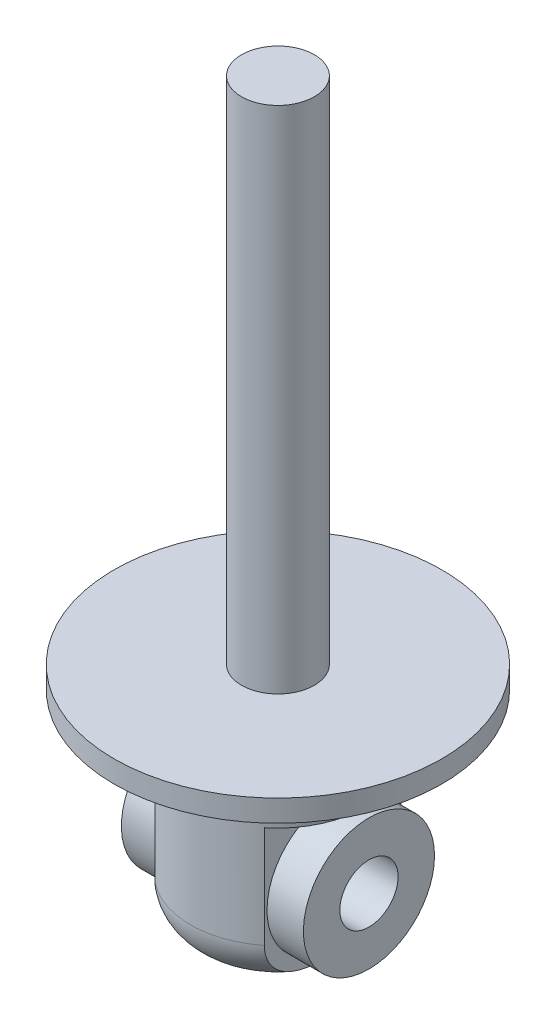
ISO-10303-21;
HEADER;
FILE_DESCRIPTION(('STEP AP214'),'2;1');
FILE_NAME('part.step','',(''),(''),'','','');
FILE_SCHEMA(('AUTOMOTIVE_DESIGN { 1 0 10303 214 1 1 1 1 }'));
ENDSEC;
DATA;
#1=APPLICATION_CONTEXT('core data for automotive mechanical design processes');
#2=APPLICATION_PROTOCOL_DEFINITION('international standard','automotive_design',2000,#1);
#3=PRODUCT_CONTEXT('',#1,'mechanical');
#4=PRODUCT('Part','Part','',(#3));
#5=PRODUCT_RELATED_PRODUCT_CATEGORY('part','',(#4));
#6=PRODUCT_DEFINITION_FORMATION('','',#4);
#7=PRODUCT_DEFINITION_CONTEXT('part definition',#1,'design');
#8=PRODUCT_DEFINITION('design','',#6,#7);
#9=PRODUCT_DEFINITION_SHAPE('','',#8);
#10=(LENGTH_UNIT() NAMED_UNIT(*) SI_UNIT(.MILLI.,.METRE.));
#11=(NAMED_UNIT(*) PLANE_ANGLE_UNIT() SI_UNIT($,.RADIAN.));
#12=(NAMED_UNIT(*) SI_UNIT($,.STERADIAN.) SOLID_ANGLE_UNIT());
#13=UNCERTAINTY_MEASURE_WITH_UNIT(LENGTH_MEASURE(1.E-05),#10,'distance_accuracy_value','');
#14=(GEOMETRIC_REPRESENTATION_CONTEXT(3) GLOBAL_UNCERTAINTY_ASSIGNED_CONTEXT((#13)) GLOBAL_UNIT_ASSIGNED_CONTEXT((#10,
#11,#12)) REPRESENTATION_CONTEXT('',''));
#15=CARTESIAN_POINT('',(0.,0.,0.));
#16=DIRECTION('',(0.,0.,1.));
#17=DIRECTION('',(1.,0.,0.));
#18=AXIS2_PLACEMENT_3D('',#15,#16,#17);
#19=CARTESIAN_POINT('',(-7.5,-8.,-22.5));
#20=DIRECTION('',(1.,0.,0.));
#21=DIRECTION('',(0.,1.,0.));
#22=AXIS2_PLACEMENT_3D('',#19,#20,#21);
#23=PLANE('',#22);
#24=CARTESIAN_POINT('',(-7.5,-27.8094750193111,0.));
#25=CARTESIAN_POINT('',(-7.5,-27.8094752958151,0.184521628242419));
#26=CARTESIAN_POINT('',(-7.5,-27.8077270322999,0.369043480287191));
#27=CARTESIAN_POINT('',(-7.5,-27.8006130628877,0.737999394292284));
#28=CARTESIAN_POINT('',(-7.5,-27.7952477367066,0.922433463434383));
#29=CARTESIAN_POINT('',(-7.5,-27.780538513706,1.29122559425462));
#30=CARTESIAN_POINT('',(-7.5,-27.7711929215574,1.47558358999919));
#31=CARTESIAN_POINT('',(-7.5,-27.7479507640883,1.84401846668315));
#32=CARTESIAN_POINT('',(-7.5,-27.734054140347,2.02809534398339));
#33=CARTESIAN_POINT('',(-7.5,-27.701027325669,2.39498843631837));
#34=CARTESIAN_POINT('',(-7.5,-27.6819201299087,2.57780665418326));
#35=CARTESIAN_POINT('',(-7.5,-27.6375682217561,2.94269408038083));
#36=CARTESIAN_POINT('',(-7.5,-27.6123230495969,3.12476323156505));
#37=CARTESIAN_POINT('',(-7.5,-27.5259360262262,3.6691632505479));
#38=CARTESIAN_POINT('',(-7.5,-27.4541196223952,4.02997739530099));
#39=CARTESIAN_POINT('',(-7.5,-27.315114172541,4.57935988961709));
#40=CARTESIAN_POINT('',(-7.5,-27.2608348848703,4.77122256452969));
#41=CARTESIAN_POINT('',(-7.5,-27.1402411036094,5.15109529504942));
#42=CARTESIAN_POINT('',(-7.5,-27.0739312594077,5.33910680786539));
#43=CARTESIAN_POINT('',(-7.5,-26.928148698992,5.70992505463463));
#44=CARTESIAN_POINT('',(-7.5,-26.8486797977089,5.8927332791208));
#45=CARTESIAN_POINT('',(-7.5,-26.6756224712841,6.25155879665883));
#46=CARTESIAN_POINT('',(-7.5,-26.5820364486502,6.42757723883459));
#47=CARTESIAN_POINT('',(-7.5,-26.3958384208508,6.74413785402998));
#48=CARTESIAN_POINT('',(-7.5,-26.3053527427416,6.8859302136676));
#49=CARTESIAN_POINT('',(-7.5,-26.1136422044668,7.16205254122039));
#50=CARTESIAN_POINT('',(-7.5,-26.0124194056704,7.29638393401336));
#51=CARTESIAN_POINT('',(-7.5,-25.7991822855038,7.55627452274061));
#52=CARTESIAN_POINT('',(-7.5,-25.6871652583255,7.6818315054992));
#53=CARTESIAN_POINT('',(-7.5,-25.4525813942248,7.92270374400352));
#54=CARTESIAN_POINT('',(-7.5,-25.3300144777409,8.03801892249803));
#55=CARTESIAN_POINT('',(-7.5,-25.0736714823962,8.25792234562975));
#56=CARTESIAN_POINT('',(-7.5,-24.9398051473305,8.36240569865935));
#57=CARTESIAN_POINT('',(-7.5,-24.662616920615,8.55796576900282));
#58=CARTESIAN_POINT('',(-7.5,-24.5192963548439,8.64904436046083));
#59=CARTESIAN_POINT('',(-7.5,-24.2243409104845,8.81636481076627));
#60=CARTESIAN_POINT('',(-7.5,-24.0727112205184,8.89261579636784));
#61=CARTESIAN_POINT('',(-7.5,-23.7624095052739,9.02909243430965));
#62=CARTESIAN_POINT('',(-7.5,-23.6037388369551,9.08932115899453));
#63=CARTESIAN_POINT('',(-7.5,-23.3052245459151,9.1849514334904));
#64=CARTESIAN_POINT('',(-7.5,-23.1661361294911,9.22272405795734));
#65=CARTESIAN_POINT('',(-7.5,-22.8851087613884,9.28547940350164));
#66=CARTESIAN_POINT('',(-7.5,-22.7431701638949,9.31046370365637));
#67=CARTESIAN_POINT('',(-7.5,-22.4576599589478,9.34730641699016));
#68=CARTESIAN_POINT('',(-7.5,-22.3140890586128,9.35917031033292));
#69=CARTESIAN_POINT('',(-7.5,-22.0264648581988,9.36963164548865));
#70=CARTESIAN_POINT('',(-7.5,-21.8824115750842,9.36822954903948));
#71=CARTESIAN_POINT('',(-7.5,-21.6061914815275,9.35280339576898));
#72=CARTESIAN_POINT('',(-7.5,-21.4739684759154,9.33976569953801));
#73=CARTESIAN_POINT('',(-7.5,-21.2110534946456,9.30256363878721));
#74=CARTESIAN_POINT('',(-7.5,-21.0803620180608,9.27839574533066));
#75=CARTESIAN_POINT('',(-7.5,-20.8215410609612,9.21922065645586));
#76=CARTESIAN_POINT('',(-7.5,-20.6934101253726,9.18421981495561));
#77=CARTESIAN_POINT('',(-7.5,-20.4404340442512,9.10374552536161));
#78=CARTESIAN_POINT('',(-7.5,-20.3155901493276,9.05826815366643));
#79=CARTESIAN_POINT('',(-7.5,-20.0692031015505,8.95699564520569));
#80=CARTESIAN_POINT('',(-7.5,-19.9476868658852,8.90113499399756));
#81=CARTESIAN_POINT('',(-7.5,-19.7094920695403,8.77987692751897));
#82=CARTESIAN_POINT('',(-7.5,-19.5928152563103,8.71447610526943));
#83=CARTESIAN_POINT('',(-7.5,-19.2509911073174,8.50489875856372));
#84=CARTESIAN_POINT('',(-7.5,-19.0339195251877,8.34729299116935));
#85=CARTESIAN_POINT('',(-7.5,-18.609337427954,7.98870608163153));
#86=CARTESIAN_POINT('',(-7.5,-18.4039002281567,7.78529755950601));
#87=CARTESIAN_POINT('',(-7.5,-18.0246758733926,7.35109040646743));
#88=CARTESIAN_POINT('',(-7.5,-17.8508837047537,7.12029612399674));
#89=CARTESIAN_POINT('',(-7.5,-17.5744409595824,6.69864287979115));
#90=CARTESIAN_POINT('',(-7.5,-17.4648689537028,6.51223410047273));
#91=CARTESIAN_POINT('',(-7.5,-17.2626904112623,6.13034538679086));
#92=CARTESIAN_POINT('',(-7.5,-17.1700919878543,5.93486117014359));
#93=CARTESIAN_POINT('',(-7.5,-17.0006313082269,5.53658641063458));
#94=CARTESIAN_POINT('',(-7.5,-16.9238147555949,5.33377659321381));
#95=CARTESIAN_POINT('',(-7.5,-16.784875362625,4.92331428460811));
#96=CARTESIAN_POINT('',(-7.5,-16.7227484430634,4.71566315546475));
#97=CARTESIAN_POINT('',(-7.5,-16.5386673542946,4.02250667384636));
#98=CARTESIAN_POINT('',(-7.5,-16.4449803111871,3.52942656369883));
#99=CARTESIAN_POINT('',(-7.5,-16.3412352530644,2.78498720051468));
#100=CARTESIAN_POINT('',(-7.5,-16.3127705467372,2.53568557770051));
#101=CARTESIAN_POINT('',(-7.5,-16.2658269581612,2.0361243493744));
#102=CARTESIAN_POINT('',(-7.5,-16.2473468655649,1.78586486368144));
#103=CARTESIAN_POINT('',(-7.5,-16.2184283009414,1.28363112408655));
#104=CARTESIAN_POINT('',(-7.5,-16.208031590786,1.03165466176094));
#105=CARTESIAN_POINT('',(-7.5,-16.1941849220444,0.527501194688707));
#106=CARTESIAN_POINT('',(-7.5,-16.1907352988047,0.27532418084894));
#107=CARTESIAN_POINT('',(-7.5,-16.1903333462322,-0.228731345602946));
#108=CARTESIAN_POINT('',(-7.5,-16.193373232494,-0.480609853630145));
#109=CARTESIAN_POINT('',(-7.5,-16.2063332691715,-0.984173581494236));
#110=CARTESIAN_POINT('',(-7.5,-16.2162528039696,-1.23585881660871));
#111=CARTESIAN_POINT('',(-7.5,-16.2454935008677,-1.7627882566893));
#112=CARTESIAN_POINT('',(-7.5,-16.2656211327378,-2.03798990109168));
#113=CARTESIAN_POINT('',(-7.5,-16.3180418431017,-2.58731345976836));
#114=CARTESIAN_POINT('',(-7.5,-16.3503365349836,-2.86143522597441));
#115=CARTESIAN_POINT('',(-7.5,-16.4300545548583,-3.40623279358435));
#116=CARTESIAN_POINT('',(-7.5,-16.4774071358833,-3.67691867401872));
#117=CARTESIAN_POINT('',(-7.5,-16.5907053400646,-4.2143947607995));
#118=CARTESIAN_POINT('',(-7.5,-16.6566449229111,-4.48118620316469));
#119=CARTESIAN_POINT('',(-7.5,-16.7911834026755,-4.94217748017442));
#120=CARTESIAN_POINT('',(-7.5,-16.8549558474619,-5.13778160857807));
#121=CARTESIAN_POINT('',(-7.5,-16.9961265709521,-5.52399422741739));
#122=CARTESIAN_POINT('',(-7.5,-17.0735207892669,-5.71460418712136));
#123=CARTESIAN_POINT('',(-7.5,-17.2430793617625,-6.08921987221889));
#124=CARTESIAN_POINT('',(-7.5,-17.3352463319138,-6.27322442084438));
#125=CARTESIAN_POINT('',(-7.5,-17.5351759469553,-6.63256976145457));
#126=CARTESIAN_POINT('',(-7.5,-17.6429345063483,-6.80791280693597));
#127=CARTESIAN_POINT('',(-7.5,-17.8487615005736,-7.10989658300674));
#128=CARTESIAN_POINT('',(-7.5,-17.9436617626469,-7.23870103997639));
#129=CARTESIAN_POINT('',(-7.5,-18.143229826346,-7.48856622066219));
#130=CARTESIAN_POINT('',(-7.5,-18.2478987883735,-7.60962602152205));
#131=CARTESIAN_POINT('',(-7.5,-18.4668045949393,-7.84271387792474));
#132=CARTESIAN_POINT('',(-7.5,-18.5810384459287,-7.95474473789612));
#133=CARTESIAN_POINT('',(-7.5,-18.8187268203134,-8.16854933672495));
#134=CARTESIAN_POINT('',(-7.5,-18.9421800591116,-8.27032449994957));
#135=CARTESIAN_POINT('',(-7.5,-19.1987356397018,-8.46313596223061));
#136=CARTESIAN_POINT('',(-7.5,-19.3319055781875,-8.55408255407203));
#137=CARTESIAN_POINT('',(-7.5,-19.6061418402457,-8.72304401015934));
#138=CARTESIAN_POINT('',(-7.5,-19.747204378254,-8.80106500403696));
#139=CARTESIAN_POINT('',(-7.5,-20.0362068877473,-8.94309470867639));
#140=CARTESIAN_POINT('',(-7.5,-20.1841460034049,-9.00710515749598));
#141=CARTESIAN_POINT('',(-7.5,-20.4856380297523,-9.12014361193693));
#142=CARTESIAN_POINT('',(-7.5,-20.6391901444676,-9.16917373274798));
#143=CARTESIAN_POINT('',(-7.5,-20.9313639562727,-9.24643392787081));
#144=CARTESIAN_POINT('',(-7.5,-21.0695088202567,-9.27647685632879));
#145=CARTESIAN_POINT('',(-7.5,-21.3479315795213,-9.32406143536891));
#146=CARTESIAN_POINT('',(-7.5,-21.4882092809526,-9.34160421520928));
#147=CARTESIAN_POINT('',(-7.5,-21.769719609589,-9.36396002322679));
#148=CARTESIAN_POINT('',(-7.5,-21.9109518422674,-9.36877802253041));
#149=CARTESIAN_POINT('',(-7.5,-22.1932734390957,-9.36563613906261));
#150=CARTESIAN_POINT('',(-7.5,-22.3343628067459,-9.35767657732182));
#151=CARTESIAN_POINT('',(-7.5,-22.6064011749062,-9.32998563551062));
#152=CARTESIAN_POINT('',(-7.5,-22.7374295539783,-9.31102660205279));
#153=CARTESIAN_POINT('',(-7.5,-22.9974780227225,-9.26218788836622));
#154=CARTESIAN_POINT('',(-7.5,-23.1264974548056,-9.23230470755188));
#155=CARTESIAN_POINT('',(-7.5,-23.3815508516768,-9.16196479385526));
#156=CARTESIAN_POINT('',(-7.5,-23.5075862018083,-9.12151307666088));
#157=CARTESIAN_POINT('',(-7.5,-23.7559772755244,-9.03044888037393));
#158=CARTESIAN_POINT('',(-7.5,-23.8783315975104,-8.97983258590814));
#159=CARTESIAN_POINT('',(-7.5,-24.1205569584555,-8.8680617574251));
#160=CARTESIAN_POINT('',(-7.5,-24.2403549182387,-8.80674877020291));
#161=CARTESIAN_POINT('',(-7.5,-24.4747211723639,-8.67480187441993));
#162=CARTESIAN_POINT('',(-7.5,-24.5892875713423,-8.60416462323317));
#163=CARTESIAN_POINT('',(-7.5,-24.9242270275788,-8.37928997825773));
#164=CARTESIAN_POINT('',(-7.5,-25.13600210755,-8.21201407264852));
#165=CARTESIAN_POINT('',(-7.5,-25.5504485361803,-7.832942739178));
#166=CARTESIAN_POINT('',(-7.5,-25.7507010772538,-7.618532285847));
#167=CARTESIAN_POINT('',(-7.5,-26.1185076671662,-7.16337882817298));
#168=CARTESIAN_POINT('',(-7.5,-26.2860513710234,-6.9226275303298));
#169=CARTESIAN_POINT('',(-7.5,-26.5545024709803,-6.4788664395953));
#170=CARTESIAN_POINT('',(-7.5,-26.6619013252763,-6.279707295078));
#171=CARTESIAN_POINT('',(-7.5,-26.858559219587,-5.87254463104013));
#172=CARTESIAN_POINT('',(-7.5,-26.9478095430477,-5.66453691936401));
#173=CARTESIAN_POINT('',(-7.5,-27.1096214973705,-5.24180758530233));
#174=CARTESIAN_POINT('',(-7.5,-27.1821555960046,-5.02707553901332));
#175=CARTESIAN_POINT('',(-7.5,-27.3121001369762,-4.59305326757356));
#176=CARTESIAN_POINT('',(-7.5,-27.3695048137837,-4.37376133898656));
#177=CARTESIAN_POINT('',(-7.5,-27.4981886749365,-3.81417726059937));
#178=CARTESIAN_POINT('',(-7.5,-27.5604951716191,-3.47183296905169));
#179=CARTESIAN_POINT('',(-7.5,-27.6609019684328,-2.78359200614869));
#180=CARTESIAN_POINT('',(-7.5,-27.6989863972919,-2.43769315620305));
#181=CARTESIAN_POINT('',(-7.5,-27.7425563308733,-1.91723181279188));
#182=CARTESIAN_POINT('',(-7.5,-27.7548291128016,-1.74318957751326));
#183=CARTESIAN_POINT('',(-7.5,-27.7753986995787,-1.39487161182967));
#184=CARTESIAN_POINT('',(-7.5,-27.7836956019396,-1.22059588725638));
#185=CARTESIAN_POINT('',(-7.5,-27.796777523185,-0.87196539298604));
#186=CARTESIAN_POINT('',(-7.5,-27.8015635129394,-0.697610658492172));
#187=CARTESIAN_POINT('',(-7.5,-27.8079121855994,-0.348837350643895));
#188=CARTESIAN_POINT('',(-7.5,-27.8094747579462,-0.174418775305039));
#189=CARTESIAN_POINT('',(-7.5,-27.8094750193111,0.));
#190=B_SPLINE_CURVE_WITH_KNOTS('',3,(#24,#25,#26,#27,#28,#29,#30,#31,#32,#33,#34,#35,#36,#37,
#38,#39,#40,#41,#42,#43,#44,#45,#46,#47,#48,#49,#50,#51,#52,#53,#54,#55,#56,#57,#58,#59,#60,#61,
#62,#63,#64,#65,#66,#67,#68,#69,#70,#71,#72,#73,#74,#75,#76,#77,#78,#79,#80,#81,#82,#83,#84,#85,
#86,#87,#88,#89,#90,#91,#92,#93,#94,#95,#96,#97,#98,#99,#100,#101,#102,#103,#104,#105,#106,#107,
#108,#109,#110,#111,#112,#113,#114,#115,#116,#117,#118,#119,#120,#121,#122,#123,#124,#125,#126,
#127,#128,#129,#130,#131,#132,#133,#134,#135,#136,#137,#138,#139,#140,#141,#142,#143,#144,#145,
#146,#147,#148,#149,#150,#151,#152,#153,#154,#155,#156,#157,#158,#159,#160,#161,#162,#163,#164,
#165,#166,#167,#168,#169,#170,#171,#172,#173,#174,#175,#176,#177,#178,#179,#180,#181,#182,#183,
#184,#185,#186,#187,#188,#189),.UNSPECIFIED.,.T.,.F.,(4,2,2,2,2,2,2,2,2,2,2,2,2,2,2,2,2,2,2,2,2,
2,2,2,2,2,2,2,2,2,2,2,2,2,2,2,2,2,2,2,2,2,2,2,2,2,2,2,2,2,2,2,2,2,2,2,2,2,2,2,2,2,2,2,2,2,2,2,2,
2,2,2,2,2,2,2,2,2,2,2,2,2,4),(0.,0.553556541747908,1.10705498067111,1.6607894093517,
2.21453094651203,2.76586720349669,3.31724477121585,4.41912680182766,5.01698525599297,
5.61461314908642,6.21206808675634,6.80942146164093,7.31357153503217,7.81762499361292,
8.32180513447662,8.82598907791493,9.33467160980088,9.84328295415676,10.3515802378956,
10.8597799828438,11.291588037567,11.7233427606026,12.1549170790764,12.5864763761706,
12.9845986570771,13.3828472534997,13.7808627038906,14.1790274594522,14.579795450788,
14.9807069160888,15.7821103743006,16.6461503316802,17.5100532757815,18.1578732554314,
18.8060020817716,19.4559821948789,20.1057815998326,21.6069748462105,22.3596793389022,
23.1122925673176,23.8687687149109,24.6252813779039,25.3808870860738,26.1364251884592,
26.9640249034878,27.7917343993232,28.6156111127982,29.4392203950451,30.0559954213971,
30.6725869093733,31.2892877047367,31.9058271963483,32.3853559200308,32.8649416785199,
33.3443778968313,33.823747436381,34.3068464150843,34.7897156366604,35.2725249226045,
35.7552660053908,36.1788379642465,36.6023716529343,37.0257398573389,37.4490974249689,
37.8458122806135,38.2426543730445,38.639308470493,39.0361117351622,39.4393886143668,
39.8428104576492,40.6491243408277,41.5260051520067,42.403162850804,43.0810551134699,
43.7592721958252,44.4385984678267,45.1181832448308,46.1608437011148,47.2041866484774,
47.7275747628343,48.2509500399341,48.7741805338585,49.2974289735857),.UNSPECIFIED.);
#191=CARTESIAN_POINT('',(-7.5,-22.,-9.3674969975976));
#192=VERTEX_POINT('',#191);
#193=CARTESIAN_POINT('',(-7.5,-21.9999999999999,9.36749699759766));
#194=VERTEX_POINT('',#193);
#195=EDGE_CURVE('E127',#192,#194,#190,.T.);
#196=ORIENTED_EDGE('',*,*,#195,.T.);
#197=DIRECTION('',(0.,1.,0.));
#198=VECTOR('',#197,1.);
#199=CARTESIAN_POINT('',(-7.49999999999999,-28.,9.3674969975976));
#200=LINE('',#199,#198);
#201=CARTESIAN_POINT('',(-7.5,-8.,9.36749699759759));
#202=VERTEX_POINT('',#201);
#203=EDGE_CURVE('E90',#202,#194,#200,.F.);
#204=ORIENTED_EDGE('',*,*,#203,.F.);
#205=DIRECTION('',(0.,0.,1.));
#206=VECTOR('',#205,1.);
#207=CARTESIAN_POINT('',(-7.5,-8.,-22.5));
#208=LINE('',#207,#206);
#209=CARTESIAN_POINT('',(-7.5,-8.,-9.36749699759761));
#210=VERTEX_POINT('',#209);
#211=EDGE_CURVE('E83',#210,#202,#208,.T.);
#212=ORIENTED_EDGE('',*,*,#211,.F.);
#213=DIRECTION('',(0.,1.,0.));
#214=VECTOR('',#213,1.);
#215=CARTESIAN_POINT('',(-7.49999999999999,-28.,-9.3674969975976));
#216=LINE('',#215,#214);
#217=EDGE_CURVE('E61',#192,#210,#216,.T.);
#218=ORIENTED_EDGE('',*,*,#217,.F.);
#219=EDGE_LOOP('',(#196,#204,#212,#218));
#220=FACE_BOUND('',#219,.T.);
#221=CARTESIAN_POINT('',(-7.5,-18.,0.));
#222=DIRECTION('',(1.,0.,0.));
#223=DIRECTION('',(0.,1.,0.));
#224=AXIS2_PLACEMENT_3D('',#221,#222,#223);
#225=CIRCLE('',#224,9.);
#226=CARTESIAN_POINT('',(-7.5,-9.00000000000001,0.));
#227=VERTEX_POINT('',#226);
#228=EDGE_CURVE('E11',#227,#227,#225,.F.);
#229=ORIENTED_EDGE('',*,*,#228,.F.);
#230=EDGE_LOOP('',(#229));
#231=FACE_BOUND('',#230,.T.);
#232=ADVANCED_FACE('F36',(#220,#231),#23,.F.);
#233=CARTESIAN_POINT('',(7.5,-8.,-22.5));
#234=DIRECTION('',(-1.,0.,0.));
#235=DIRECTION('',(0.,-1.,0.));
#236=AXIS2_PLACEMENT_3D('',#233,#234,#235);
#237=PLANE('',#236);
#238=CARTESIAN_POINT('',(7.5,-27.8094750193111,0.));
#239=CARTESIAN_POINT('',(7.5,-27.8094752958151,-0.18452162824242));
#240=CARTESIAN_POINT('',(7.5,-27.8077270322999,-0.369043480287192));
#241=CARTESIAN_POINT('',(7.5,-27.8006130628877,-0.737999394292285));
#242=CARTESIAN_POINT('',(7.5,-27.7952477367066,-0.922433463434386));
#243=CARTESIAN_POINT('',(7.5,-27.780538513706,-1.29122559425462));
#244=CARTESIAN_POINT('',(7.5,-27.7711929215574,-1.47558358999919));
#245=CARTESIAN_POINT('',(7.5,-27.7479507640883,-1.84401846668315));
#246=CARTESIAN_POINT('',(7.5,-27.734054140347,-2.0280953439834));
#247=CARTESIAN_POINT('',(7.5,-27.701027325669,-2.39498843631837));
#248=CARTESIAN_POINT('',(7.5,-27.6819201299087,-2.57780665418327));
#249=CARTESIAN_POINT('',(7.5,-27.6375682217561,-2.94269408038084));
#250=CARTESIAN_POINT('',(7.5,-27.6123230495969,-3.12476323156505));
#251=CARTESIAN_POINT('',(7.5,-27.5259360262262,-3.6691632505479));
#252=CARTESIAN_POINT('',(7.5,-27.4541196223952,-4.02997739530099));
#253=CARTESIAN_POINT('',(7.5,-27.315114172541,-4.57935988961709));
#254=CARTESIAN_POINT('',(7.5,-27.2608348848703,-4.7712225645297));
#255=CARTESIAN_POINT('',(7.5,-27.1402411036094,-5.15109529504943));
#256=CARTESIAN_POINT('',(7.5,-27.0739312594077,-5.3391068078654));
#257=CARTESIAN_POINT('',(7.5,-26.9281486989919,-5.70992505463463));
#258=CARTESIAN_POINT('',(7.5,-26.8486797977089,-5.8927332791208));
#259=CARTESIAN_POINT('',(7.5,-26.6756224712841,-6.25155879665883));
#260=CARTESIAN_POINT('',(7.5,-26.5820364486501,-6.42757723883459));
#261=CARTESIAN_POINT('',(7.5,-26.3958384208508,-6.74413785402998));
#262=CARTESIAN_POINT('',(7.5,-26.3053527427416,-6.8859302136676));
#263=CARTESIAN_POINT('',(7.5,-26.1136422044668,-7.16205254122039));
#264=CARTESIAN_POINT('',(7.5,-26.0124194056704,-7.29638393401336));
#265=CARTESIAN_POINT('',(7.5,-25.7991822855038,-7.55627452274061));
#266=CARTESIAN_POINT('',(7.5,-25.6871652583255,-7.6818315054992));
#267=CARTESIAN_POINT('',(7.5,-25.4525813942248,-7.92270374400352));
#268=CARTESIAN_POINT('',(7.5,-25.3300144777409,-8.03801892249803));
#269=CARTESIAN_POINT('',(7.5,-25.0736714823962,-8.25792234562975));
#270=CARTESIAN_POINT('',(7.5,-24.9398051473305,-8.36240569865935));
#271=CARTESIAN_POINT('',(7.5,-24.662616920615,-8.55796576900282));
#272=CARTESIAN_POINT('',(7.5,-24.5192963548439,-8.64904436046083));
#273=CARTESIAN_POINT('',(7.5,-24.2243409104845,-8.81636481076627));
#274=CARTESIAN_POINT('',(7.5,-24.0727112205184,-8.89261579636783));
#275=CARTESIAN_POINT('',(7.5,-23.7624095052739,-9.02909243430965));
#276=CARTESIAN_POINT('',(7.5,-23.6037388369551,-9.08932115899453));
#277=CARTESIAN_POINT('',(7.5,-23.3052245459151,-9.1849514334904));
#278=CARTESIAN_POINT('',(7.5,-23.166136129491,-9.22272405795733));
#279=CARTESIAN_POINT('',(7.5,-22.8851087613884,-9.28547940350163));
#280=CARTESIAN_POINT('',(7.5,-22.7431701638949,-9.31046370365637));
#281=CARTESIAN_POINT('',(7.5,-22.4576599589478,-9.34730641699015));
#282=CARTESIAN_POINT('',(7.5,-22.3140890586128,-9.35917031033292));
#283=CARTESIAN_POINT('',(7.5,-22.0264648581988,-9.36963164548865));
#284=CARTESIAN_POINT('',(7.5,-21.8824115750842,-9.36822954903947));
#285=CARTESIAN_POINT('',(7.5,-21.6061914815275,-9.35280339576898));
#286=CARTESIAN_POINT('',(7.5,-21.4739684759153,-9.33976569953801));
#287=CARTESIAN_POINT('',(7.5,-21.2110534946456,-9.3025636387872));
#288=CARTESIAN_POINT('',(7.5,-21.0803620180608,-9.27839574533065));
#289=CARTESIAN_POINT('',(7.5,-20.8215410609612,-9.21922065645586));
#290=CARTESIAN_POINT('',(7.5,-20.6934101253726,-9.1842198149556));
#291=CARTESIAN_POINT('',(7.5,-20.4404340442512,-9.1037455253616));
#292=CARTESIAN_POINT('',(7.5,-20.3155901493276,-9.05826815366643));
#293=CARTESIAN_POINT('',(7.5,-20.0692031015505,-8.95699564520569));
#294=CARTESIAN_POINT('',(7.5,-19.9476868658852,-8.90113499399755));
#295=CARTESIAN_POINT('',(7.5,-19.7094920695403,-8.77987692751896));
#296=CARTESIAN_POINT('',(7.5,-19.5928152563103,-8.71447610526942));
#297=CARTESIAN_POINT('',(7.5,-19.2509911073174,-8.50489875856371));
#298=CARTESIAN_POINT('',(7.5,-19.0339195251877,-8.34729299116933));
#299=CARTESIAN_POINT('',(7.5,-18.609337427954,-7.98870608163152));
#300=CARTESIAN_POINT('',(7.5,-18.4039002281567,-7.78529755950601));
#301=CARTESIAN_POINT('',(7.5,-18.0246758733926,-7.35109040646742));
#302=CARTESIAN_POINT('',(7.5,-17.8508837047537,-7.12029612399674));
#303=CARTESIAN_POINT('',(7.5,-17.5744409595824,-6.69864287979114));
#304=CARTESIAN_POINT('',(7.5,-17.4648689537028,-6.51223410047272));
#305=CARTESIAN_POINT('',(7.5,-17.2626904112622,-6.13034538679085));
#306=CARTESIAN_POINT('',(7.5,-17.1700919878543,-5.93486117014358));
#307=CARTESIAN_POINT('',(7.5,-17.0006313082269,-5.53658641063457));
#308=CARTESIAN_POINT('',(7.5,-16.9238147555949,-5.33377659321379));
#309=CARTESIAN_POINT('',(7.5,-16.784875362625,-4.92331428460809));
#310=CARTESIAN_POINT('',(7.5,-16.7227484430634,-4.71566315546473));
#311=CARTESIAN_POINT('',(7.5,-16.5386673542946,-4.02250667384634));
#312=CARTESIAN_POINT('',(7.5,-16.4449803111871,-3.5294265636988));
#313=CARTESIAN_POINT('',(7.5,-16.3412352530644,-2.78498720051465));
#314=CARTESIAN_POINT('',(7.5,-16.3127705467372,-2.53568557770048));
#315=CARTESIAN_POINT('',(7.5,-16.2658269581612,-2.03612434937437));
#316=CARTESIAN_POINT('',(7.5,-16.2473468655649,-1.7858648636814));
#317=CARTESIAN_POINT('',(7.5,-16.2184283009414,-1.28363112408651));
#318=CARTESIAN_POINT('',(7.5,-16.208031590786,-1.0316546617609));
#319=CARTESIAN_POINT('',(7.5,-16.1941849220444,-0.527501194688666));
#320=CARTESIAN_POINT('',(7.5,-16.1907352988047,-0.275324180848896));
#321=CARTESIAN_POINT('',(7.5,-16.1903333462322,0.228731345602991));
#322=CARTESIAN_POINT('',(7.5,-16.193373232494,0.480609853630189));
#323=CARTESIAN_POINT('',(7.5,-16.2063332691715,0.984173581494281));
#324=CARTESIAN_POINT('',(7.5,-16.2162528039696,1.23585881660875));
#325=CARTESIAN_POINT('',(7.5,-16.2454935008677,1.76278825668935));
#326=CARTESIAN_POINT('',(7.5,-16.2656211327378,2.03798990109173));
#327=CARTESIAN_POINT('',(7.5,-16.3180418431018,2.5873134597684));
#328=CARTESIAN_POINT('',(7.5,-16.3503365349836,2.86143522597445));
#329=CARTESIAN_POINT('',(7.5,-16.4300545548583,3.40623279358438));
#330=CARTESIAN_POINT('',(7.5,-16.4774071358833,3.67691867401874));
#331=CARTESIAN_POINT('',(7.5,-16.5907053400646,4.21439476079952));
#332=CARTESIAN_POINT('',(7.5,-16.6566449229111,4.48118620316471));
#333=CARTESIAN_POINT('',(7.5,-16.7911834026755,4.94217748017443));
#334=CARTESIAN_POINT('',(7.5,-16.8549558474619,5.13778160857808));
#335=CARTESIAN_POINT('',(7.5,-16.9961265709521,5.5239942274174));
#336=CARTESIAN_POINT('',(7.5,-17.073520789267,5.71460418712137));
#337=CARTESIAN_POINT('',(7.5,-17.2430793617625,6.0892198722189));
#338=CARTESIAN_POINT('',(7.5,-17.3352463319138,6.27322442084439));
#339=CARTESIAN_POINT('',(7.5,-17.5351759469553,6.63256976145458));
#340=CARTESIAN_POINT('',(7.5,-17.6429345063483,6.80791280693598));
#341=CARTESIAN_POINT('',(7.5,-17.8487615005737,7.10989658300674));
#342=CARTESIAN_POINT('',(7.5,-17.9436617626469,7.2387010399764));
#343=CARTESIAN_POINT('',(7.5,-18.143229826346,7.4885662206622));
#344=CARTESIAN_POINT('',(7.5,-18.2478987883735,7.60962602152205));
#345=CARTESIAN_POINT('',(7.5,-18.4668045949393,7.84271387792474));
#346=CARTESIAN_POINT('',(7.5,-18.5810384459287,7.95474473789612));
#347=CARTESIAN_POINT('',(7.5,-18.8187268203134,8.16854933672494));
#348=CARTESIAN_POINT('',(7.5,-18.9421800591116,8.27032449994957));
#349=CARTESIAN_POINT('',(7.5,-19.1987356397018,8.46313596223061));
#350=CARTESIAN_POINT('',(7.5,-19.3319055781875,8.55408255407203));
#351=CARTESIAN_POINT('',(7.5,-19.6061418402457,8.72304401015934));
#352=CARTESIAN_POINT('',(7.5,-19.747204378254,8.80106500403696));
#353=CARTESIAN_POINT('',(7.5,-20.0362068877473,8.94309470867639));
#354=CARTESIAN_POINT('',(7.5,-20.1841460034049,9.00710515749598));
#355=CARTESIAN_POINT('',(7.5,-20.4856380297523,9.12014361193692));
#356=CARTESIAN_POINT('',(7.5,-20.6391901444676,9.16917373274798));
#357=CARTESIAN_POINT('',(7.5,-20.9313639562727,9.24643392787081));
#358=CARTESIAN_POINT('',(7.5,-21.0695088202567,9.27647685632879));
#359=CARTESIAN_POINT('',(7.5,-21.3479315795213,9.32406143536891));
#360=CARTESIAN_POINT('',(7.5,-21.4882092809527,9.34160421520928));
#361=CARTESIAN_POINT('',(7.5,-21.769719609589,9.36396002322678));
#362=CARTESIAN_POINT('',(7.5,-21.9109518422674,9.3687780225304));
#363=CARTESIAN_POINT('',(7.5,-22.1932734390957,9.3656361390626));
#364=CARTESIAN_POINT('',(7.5,-22.3343628067459,9.35767657732181));
#365=CARTESIAN_POINT('',(7.5,-22.6064011749062,9.32998563551062));
#366=CARTESIAN_POINT('',(7.5,-22.7374295539783,9.31102660205278));
#367=CARTESIAN_POINT('',(7.5,-22.9974780227225,9.26218788836621));
#368=CARTESIAN_POINT('',(7.5,-23.1264974548056,9.23230470755187));
#369=CARTESIAN_POINT('',(7.5,-23.3815508516768,9.16196479385525));
#370=CARTESIAN_POINT('',(7.5,-23.5075862018083,9.12151307666088));
#371=CARTESIAN_POINT('',(7.5,-23.7559772755244,9.03044888037393));
#372=CARTESIAN_POINT('',(7.5,-23.8783315975104,8.97983258590813));
#373=CARTESIAN_POINT('',(7.5,-24.1205569584555,8.86806175742509));
#374=CARTESIAN_POINT('',(7.5,-24.2403549182387,8.8067487702029));
#375=CARTESIAN_POINT('',(7.5,-24.4747211723639,8.67480187441993));
#376=CARTESIAN_POINT('',(7.5,-24.5892875713423,8.60416462323316));
#377=CARTESIAN_POINT('',(7.5,-24.9242270275788,8.37928997825773));
#378=CARTESIAN_POINT('',(7.5,-25.13600210755,8.21201407264851));
#379=CARTESIAN_POINT('',(7.5,-25.5504485361803,7.832942739178));
#380=CARTESIAN_POINT('',(7.5,-25.7507010772538,7.61853228584699));
#381=CARTESIAN_POINT('',(7.5,-26.1185076671662,7.16337882817298));
#382=CARTESIAN_POINT('',(7.5,-26.2860513710234,6.92262753032979));
#383=CARTESIAN_POINT('',(7.5,-26.5545024709803,6.4788664395953));
#384=CARTESIAN_POINT('',(7.5,-26.6619013252763,6.27970729507799));
#385=CARTESIAN_POINT('',(7.5,-26.858559219587,5.87254463104012));
#386=CARTESIAN_POINT('',(7.5,-26.9478095430477,5.664536919364));
#387=CARTESIAN_POINT('',(7.5,-27.1096214973705,5.24180758530232));
#388=CARTESIAN_POINT('',(7.5,-27.1821555960046,5.02707553901331));
#389=CARTESIAN_POINT('',(7.5,-27.3121001369762,4.59305326757355));
#390=CARTESIAN_POINT('',(7.5,-27.3695048137837,4.37376133898656));
#391=CARTESIAN_POINT('',(7.5,-27.4981886749365,3.81417726059936));
#392=CARTESIAN_POINT('',(7.5,-27.5604951716191,3.47183296905169));
#393=CARTESIAN_POINT('',(7.5,-27.6609019684328,2.78359200614869));
#394=CARTESIAN_POINT('',(7.5,-27.6989863972919,2.43769315620305));
#395=CARTESIAN_POINT('',(7.5,-27.7425563308733,1.91723181279187));
#396=CARTESIAN_POINT('',(7.5,-27.7548291128016,1.74318957751326));
#397=CARTESIAN_POINT('',(7.5,-27.7753986995787,1.39487161182967));
#398=CARTESIAN_POINT('',(7.5,-27.7836956019396,1.22059588725638));
#399=CARTESIAN_POINT('',(7.5,-27.796777523185,0.871965392986036));
#400=CARTESIAN_POINT('',(7.5,-27.8015635129394,0.697610658492169));
#401=CARTESIAN_POINT('',(7.5,-27.8079121855994,0.348837350643893));
#402=CARTESIAN_POINT('',(7.5,-27.8094747579462,0.174418775305038));
#403=CARTESIAN_POINT('',(7.5,-27.8094750193111,0.));
#404=B_SPLINE_CURVE_WITH_KNOTS('',3,(#238,#239,#240,#241,#242,#243,#244,#245,#246,#247,#248,
#249,#250,#251,#252,#253,#254,#255,#256,#257,#258,#259,#260,#261,#262,#263,#264,#265,#266,#267,
#268,#269,#270,#271,#272,#273,#274,#275,#276,#277,#278,#279,#280,#281,#282,#283,#284,#285,#286,
#287,#288,#289,#290,#291,#292,#293,#294,#295,#296,#297,#298,#299,#300,#301,#302,#303,#304,#305,
#306,#307,#308,#309,#310,#311,#312,#313,#314,#315,#316,#317,#318,#319,#320,#321,#322,#323,#324,
#325,#326,#327,#328,#329,#330,#331,#332,#333,#334,#335,#336,#337,#338,#339,#340,#341,#342,#343,
#344,#345,#346,#347,#348,#349,#350,#351,#352,#353,#354,#355,#356,#357,#358,#359,#360,#361,#362,
#363,#364,#365,#366,#367,#368,#369,#370,#371,#372,#373,#374,#375,#376,#377,#378,#379,#380,#381,
#382,#383,#384,#385,#386,#387,#388,#389,#390,#391,#392,#393,#394,#395,#396,#397,#398,#399,#400,
#401,#402,#403),.UNSPECIFIED.,.T.,.F.,(4,2,2,2,2,2,2,2,2,2,2,2,2,2,2,2,2,2,2,2,2,2,2,2,2,2,2,2,
2,2,2,2,2,2,2,2,2,2,2,2,2,2,2,2,2,2,2,2,2,2,2,2,2,2,2,2,2,2,2,2,2,2,2,2,2,2,2,2,2,2,2,2,2,2,2,2,
2,2,2,2,2,2,4),(0.,0.553556541747909,1.10705498067111,1.66078940935171,2.21453094651203,
2.7658672034967,3.31724477121586,4.41912680182767,5.01698525599298,5.61461314908643,
6.21206808675635,6.80942146164093,7.31357153503217,7.81762499361292,8.32180513447662,
8.82598907791494,9.33467160980089,9.84328295415677,10.3515802378956,10.8597799828438,
11.291588037567,11.7233427606026,12.1549170790764,12.5864763761707,12.9845986570771,
13.3828472534997,13.7808627038906,14.1790274594522,14.579795450788,14.9807069160888,
15.7821103743006,16.6461503316802,17.5100532757815,18.1578732554314,18.8060020817716,
19.4559821948789,20.1057815998326,21.6069748462106,22.3596793389022,23.1122925673176,
23.8687687149109,24.6252813779039,25.3808870860739,26.1364251884592,26.9640249034878,
27.7917343993232,28.6156111127982,29.4392203950451,30.0559954213971,30.6725869093732,
31.2892877047367,31.9058271963482,32.3853559200308,32.8649416785199,33.3443778968313,
33.823747436381,34.3068464150843,34.7897156366603,35.2725249226045,35.7552660053908,
36.1788379642465,36.6023716529342,37.0257398573389,37.4490974249689,37.8458122806135,
38.2426543730445,38.6393084704929,39.0361117351622,39.4393886143667,39.8428104576491,
40.6491243408277,41.5260051520067,42.4031628508039,43.0810551134699,43.7592721958252,
44.4385984678267,45.1181832448308,46.1608437011148,47.2041866484774,47.7275747628343,
48.2509500399341,48.7741805338585,49.2974289735857),.UNSPECIFIED.);
#405=CARTESIAN_POINT('',(7.5,-22.,9.3674969975976));
#406=VERTEX_POINT('',#405);
#407=CARTESIAN_POINT('',(7.5,-21.9999999999999,-9.36749699759765));
#408=VERTEX_POINT('',#407);
#409=EDGE_CURVE('E87',#406,#408,#404,.T.);
#410=ORIENTED_EDGE('',*,*,#409,.T.);
#411=DIRECTION('',(0.,1.,0.));
#412=VECTOR('',#411,1.);
#413=CARTESIAN_POINT('',(7.5,-28.,-9.3674969975976));
#414=LINE('',#413,#412);
#415=CARTESIAN_POINT('',(7.5,-8.,-9.3674969975976));
#416=VERTEX_POINT('',#415);
#417=EDGE_CURVE('E101',#416,#408,#414,.F.);
#418=ORIENTED_EDGE('',*,*,#417,.F.);
#419=DIRECTION('',(0.,0.,1.));
#420=VECTOR('',#419,1.);
#421=CARTESIAN_POINT('',(7.5,-8.,-22.5));
#422=LINE('',#421,#420);
#423=CARTESIAN_POINT('',(7.5,-8.,9.36749699759759));
#424=VERTEX_POINT('',#423);
#425=EDGE_CURVE('E91',#416,#424,#422,.T.);
#426=ORIENTED_EDGE('',*,*,#425,.T.);
#427=DIRECTION('',(0.,1.,0.));
#428=VECTOR('',#427,1.);
#429=CARTESIAN_POINT('',(7.5,-28.,9.3674969975976));
#430=LINE('',#429,#428);
#431=EDGE_CURVE('E53',#406,#424,#430,.T.);
#432=ORIENTED_EDGE('',*,*,#431,.F.);
#433=EDGE_LOOP('',(#410,#418,#426,#432));
#434=FACE_BOUND('',#433,.T.);
#435=CARTESIAN_POINT('',(7.5,-18.,0.));
#436=DIRECTION('',(-1.,0.,0.));
#437=DIRECTION('',(0.,-1.,0.));
#438=AXIS2_PLACEMENT_3D('',#435,#436,#437);
#439=CIRCLE('',#438,9.);
#440=CARTESIAN_POINT('',(7.5,-27.,0.));
#441=VERTEX_POINT('',#440);
#442=EDGE_CURVE('E41',#441,#441,#439,.F.);
#443=ORIENTED_EDGE('',*,*,#442,.F.);
#444=EDGE_LOOP('',(#443));
#445=FACE_BOUND('',#444,.T.);
#446=ADVANCED_FACE('F141',(#434,#445),#237,.F.);
#447=CARTESIAN_POINT('',(0.,3.,0.));
#448=DIRECTION('',(0.,-1.,0.));
#449=DIRECTION('',(0.,0.,-1.));
#450=AXIS2_PLACEMENT_3D('',#447,#448,#449);
#451=CYLINDRICAL_SURFACE('',#450,22.5);
#452=CARTESIAN_POINT('',(0.,3.,0.));
#453=DIRECTION('',(0.,1.,0.));
#454=DIRECTION('',(0.,0.,1.));
#455=AXIS2_PLACEMENT_3D('',#452,#453,#454);
#456=CIRCLE('',#455,22.5);
#457=CARTESIAN_POINT('',(0.,3.,22.5));
#458=VERTEX_POINT('',#457);
#459=EDGE_CURVE('E118',#458,#458,#456,.T.);
#460=ORIENTED_EDGE('',*,*,#459,.F.);
#461=EDGE_LOOP('',(#460));
#462=FACE_BOUND('',#461,.T.);
#463=CARTESIAN_POINT('',(0.,0.,0.));
#464=DIRECTION('',(0.,1.,0.));
#465=DIRECTION('',(0.,0.,1.));
#466=AXIS2_PLACEMENT_3D('',#463,#464,#465);
#467=CIRCLE('',#466,22.5);
#468=CARTESIAN_POINT('',(0.,0.,22.5));
#469=VERTEX_POINT('',#468);
#470=EDGE_CURVE('E115',#469,#469,#467,.T.);
#471=ORIENTED_EDGE('',*,*,#470,.T.);
#472=EDGE_LOOP('',(#471));
#473=FACE_BOUND('',#472,.T.);
#474=ADVANCED_FACE('F163',(#462,#473),#451,.T.);
#475=CARTESIAN_POINT('',(0.,3.,0.));
#476=DIRECTION('',(0.,1.,0.));
#477=DIRECTION('',(0.,0.,1.));
#478=AXIS2_PLACEMENT_3D('',#475,#476,#477);
#479=PLANE('',#478);
#480=CARTESIAN_POINT('',(0.,3.,0.));
#481=DIRECTION('',(0.,1.,0.));
#482=DIRECTION('',(0.,0.,1.));
#483=AXIS2_PLACEMENT_3D('',#480,#481,#482);
#484=CIRCLE('',#483,5.);
#485=CARTESIAN_POINT('',(0.,3.,5.));
#486=VERTEX_POINT('',#485);
#487=EDGE_CURVE('E112',#486,#486,#484,.T.);
#488=ORIENTED_EDGE('',*,*,#487,.F.);
#489=EDGE_LOOP('',(#488));
#490=FACE_BOUND('',#489,.T.);
#491=ORIENTED_EDGE('',*,*,#459,.T.);
#492=EDGE_LOOP('',(#491));
#493=FACE_BOUND('',#492,.T.);
#494=ADVANCED_FACE('F160',(#490,#493),#479,.T.);
#495=CARTESIAN_POINT('',(0.,0.,0.));
#496=DIRECTION('',(0.,1.,0.));
#497=DIRECTION('',(0.,0.,1.));
#498=AXIS2_PLACEMENT_3D('',#495,#496,#497);
#499=PLANE('',#498);
#500=CARTESIAN_POINT('',(0.,0.,0.));
#501=DIRECTION('',(0.,-1.,0.));
#502=DIRECTION('',(0.,0.,-1.));
#503=AXIS2_PLACEMENT_3D('',#500,#501,#502);
#504=CIRCLE('',#503,12.);
#505=CARTESIAN_POINT('',(0.,0.,-12.));
#506=VERTEX_POINT('',#505);
#507=EDGE_CURVE('E108',#506,#506,#504,.T.);
#508=ORIENTED_EDGE('',*,*,#507,.F.);
#509=EDGE_LOOP('',(#508));
#510=FACE_BOUND('',#509,.T.);
#511=ORIENTED_EDGE('',*,*,#470,.F.);
#512=EDGE_LOOP('',(#511));
#513=FACE_BOUND('',#512,.T.);
#514=ADVANCED_FACE('F158',(#510,#513),#499,.F.);
#515=CARTESIAN_POINT('',(0.,73.,0.));
#516=DIRECTION('',(0.,-1.,0.));
#517=DIRECTION('',(0.,0.,-1.));
#518=AXIS2_PLACEMENT_3D('',#515,#516,#517);
#519=CYLINDRICAL_SURFACE('',#518,5.);
#520=CARTESIAN_POINT('',(0.,73.,0.));
#521=DIRECTION('',(0.,1.,0.));
#522=DIRECTION('',(0.,0.,1.));
#523=AXIS2_PLACEMENT_3D('',#520,#521,#522);
#524=CIRCLE('',#523,5.);
#525=CARTESIAN_POINT('',(0.,73.,5.));
#526=VERTEX_POINT('',#525);
#527=EDGE_CURVE('E107',#526,#526,#524,.T.);
#528=ORIENTED_EDGE('',*,*,#527,.F.);
#529=EDGE_LOOP('',(#528));
#530=FACE_BOUND('',#529,.T.);
#531=ORIENTED_EDGE('',*,*,#487,.T.);
#532=EDGE_LOOP('',(#531));
#533=FACE_BOUND('',#532,.T.);
#534=ADVANCED_FACE('F154',(#530,#533),#519,.T.);
#535=CARTESIAN_POINT('',(0.,73.,0.));
#536=DIRECTION('',(0.,1.,0.));
#537=DIRECTION('',(0.,0.,1.));
#538=AXIS2_PLACEMENT_3D('',#535,#536,#537);
#539=PLANE('',#538);
#540=ORIENTED_EDGE('',*,*,#527,.T.);
#541=EDGE_LOOP('',(#540));
#542=FACE_BOUND('',#541,.T.);
#543=ADVANCED_FACE('F151',(#542),#539,.T.);
#544=CARTESIAN_POINT('',(0.,-28.,0.));
#545=DIRECTION('',(0.,1.,0.));
#546=DIRECTION('',(0.,0.,1.));
#547=AXIS2_PLACEMENT_3D('',#544,#545,#546);
#548=CYLINDRICAL_SURFACE('',#547,12.);
#549=CARTESIAN_POINT('',(0.,-22.,0.));
#550=DIRECTION('',(0.,-1.,0.));
#551=DIRECTION('',(0.,0.,-1.));
#552=AXIS2_PLACEMENT_3D('',#549,#550,#551);
#553=CIRCLE('',#552,12.);
#554=EDGE_CURVE('E126',#194,#406,#553,.F.);
#555=ORIENTED_EDGE('',*,*,#554,.T.);
#556=ORIENTED_EDGE('',*,*,#431,.T.);
#557=CARTESIAN_POINT('',(0.,-8.,0.));
#558=DIRECTION('',(0.,1.,0.));
#559=DIRECTION('',(-1.,0.,0.));
#560=AXIS2_PLACEMENT_3D('',#557,#558,#559);
#561=CIRCLE('',#560,12.);
#562=EDGE_CURVE('E86',#424,#416,#561,.T.);
#563=ORIENTED_EDGE('',*,*,#562,.T.);
#564=ORIENTED_EDGE('',*,*,#417,.T.);
#565=EDGE_CURVE('E100',#408,#192,#553,.F.);
#566=ORIENTED_EDGE('',*,*,#565,.T.);
#567=ORIENTED_EDGE('',*,*,#217,.T.);
#568=CARTESIAN_POINT('',(0.,-8.,0.));
#569=DIRECTION('',(0.,1.,0.));
#570=DIRECTION('',(-1.,0.,0.));
#571=AXIS2_PLACEMENT_3D('',#568,#569,#570);
#572=CIRCLE('',#571,12.);
#573=EDGE_CURVE('E81',#210,#202,#572,.T.);
#574=ORIENTED_EDGE('',*,*,#573,.T.);
#575=ORIENTED_EDGE('',*,*,#203,.T.);
#576=EDGE_LOOP('',(#555,#556,#563,#564,#566,#567,#574,#575));
#577=FACE_BOUND('',#576,.T.);
#578=ORIENTED_EDGE('',*,*,#507,.T.);
#579=EDGE_LOOP('',(#578));
#580=FACE_BOUND('',#579,.T.);
#581=ADVANCED_FACE('F96',(#577,#580),#548,.T.);
#582=CARTESIAN_POINT('',(0.,-28.,0.));
#583=DIRECTION('',(0.,-1.,0.));
#584=DIRECTION('',(0.,0.,-1.));
#585=AXIS2_PLACEMENT_3D('',#582,#583,#584);
#586=PLANE('',#585);
#587=CARTESIAN_POINT('',(0.,-28.,0.));
#588=DIRECTION('',(0.,-1.,0.));
#589=DIRECTION('',(0.,0.,-1.));
#590=AXIS2_PLACEMENT_3D('',#587,#588,#589);
#591=CIRCLE('',#590,6.);
#592=CARTESIAN_POINT('',(0.,-28.,-6.));
#593=VERTEX_POINT('',#592);
#594=EDGE_CURVE('E111',#593,#593,#591,.T.);
#595=ORIENTED_EDGE('',*,*,#594,.T.);
#596=EDGE_LOOP('',(#595));
#597=FACE_BOUND('',#596,.T.);
#598=ADVANCED_FACE('F145',(#597),#586,.T.);
#599=CARTESIAN_POINT('',(0.,-22.,0.));
#600=DIRECTION('',(0.,-1.,0.));
#601=DIRECTION('',(0.,0.,-1.));
#602=AXIS2_PLACEMENT_3D('',#599,#600,#601);
#603=TOROIDAL_SURFACE('',#602,6.,6.);
#604=ORIENTED_EDGE('',*,*,#409,.F.);
#605=ORIENTED_EDGE('',*,*,#554,.F.);
#606=ORIENTED_EDGE('',*,*,#195,.F.);
#607=ORIENTED_EDGE('',*,*,#565,.F.);
#608=EDGE_LOOP('',(#604,#605,#606,#607));
#609=FACE_BOUND('',#608,.T.);
#610=ORIENTED_EDGE('',*,*,#594,.F.);
#611=EDGE_LOOP('',(#610));
#612=FACE_BOUND('',#611,.T.);
#613=ADVANCED_FACE('F38',(#609,#612),#603,.T.);
#614=CARTESIAN_POINT('',(-26.5,-8.,-22.5));
#615=DIRECTION('',(0.,1.,0.));
#616=DIRECTION('',(-1.,0.,0.));
#617=AXIS2_PLACEMENT_3D('',#614,#615,#616);
#618=PLANE('',#617);
#619=ORIENTED_EDGE('',*,*,#211,.T.);
#620=ORIENTED_EDGE('',*,*,#573,.F.);
#621=EDGE_LOOP('',(#619,#620));
#622=FACE_BOUND('',#621,.T.);
#623=ADVANCED_FACE('F82',(#622),#618,.F.);
#624=CARTESIAN_POINT('',(26.5,-8.,-22.5));
#625=DIRECTION('',(0.,1.,0.));
#626=DIRECTION('',(-1.,0.,0.));
#627=AXIS2_PLACEMENT_3D('',#624,#625,#626);
#628=PLANE('',#627);
#629=ORIENTED_EDGE('',*,*,#425,.F.);
#630=ORIENTED_EDGE('',*,*,#562,.F.);
#631=EDGE_LOOP('',(#629,#630));
#632=FACE_BOUND('',#631,.T.);
#633=ADVANCED_FACE('F142',(#632),#628,.F.);
#634=CARTESIAN_POINT('',(12.5,-18.,0.));
#635=DIRECTION('',(-1.,0.,0.));
#636=DIRECTION('',(0.,0.,1.));
#637=AXIS2_PLACEMENT_3D('',#634,#635,#636);
#638=CYLINDRICAL_SURFACE('',#637,9.);
#639=CARTESIAN_POINT('',(12.5,-18.,0.));
#640=DIRECTION('',(1.,0.,0.));
#641=DIRECTION('',(0.,0.,-1.));
#642=AXIS2_PLACEMENT_3D('',#639,#640,#641);
#643=CIRCLE('',#642,9.);
#644=CARTESIAN_POINT('',(12.5,-18.,-9.));
#645=VERTEX_POINT('',#644);
#646=EDGE_CURVE('E92',#645,#645,#643,.T.);
#647=ORIENTED_EDGE('',*,*,#646,.F.);
#648=EDGE_LOOP('',(#647));
#649=FACE_BOUND('',#648,.T.);
#650=ORIENTED_EDGE('',*,*,#442,.T.);
#651=EDGE_LOOP('',(#650));
#652=FACE_BOUND('',#651,.T.);
#653=ADVANCED_FACE('F192',(#649,#652),#638,.T.);
#654=CARTESIAN_POINT('',(12.5,-18.,0.));
#655=DIRECTION('',(1.,0.,0.));
#656=DIRECTION('',(0.,0.,-1.));
#657=AXIS2_PLACEMENT_3D('',#654,#655,#656);
#658=PLANE('',#657);
#659=ORIENTED_EDGE('',*,*,#646,.T.);
#660=EDGE_LOOP('',(#659));
#661=FACE_BOUND('',#660,.T.);
#662=CARTESIAN_POINT('',(12.5,-18.,0.));
#663=DIRECTION('',(1.,0.,0.));
#664=DIRECTION('',(0.,0.,-1.));
#665=AXIS2_PLACEMENT_3D('',#662,#663,#664);
#666=CIRCLE('',#665,4.);
#667=CARTESIAN_POINT('',(12.5,-18.,-4.));
#668=VERTEX_POINT('',#667);
#669=EDGE_CURVE('E207',#668,#668,#666,.T.);
#670=ORIENTED_EDGE('',*,*,#669,.F.);
#671=EDGE_LOOP('',(#670));
#672=FACE_BOUND('',#671,.T.);
#673=ADVANCED_FACE('F190',(#661,#672),#658,.T.);
#674=CARTESIAN_POINT('',(-12.5,-18.,0.));
#675=DIRECTION('',(1.,0.,0.));
#676=DIRECTION('',(0.,0.,-1.));
#677=AXIS2_PLACEMENT_3D('',#674,#675,#676);
#678=CIRCLE('',#677,9.);
#679=CARTESIAN_POINT('',(-12.5,-18.,-9.));
#680=VERTEX_POINT('',#679);
#681=EDGE_CURVE('E208',#680,#680,#678,.T.);
#682=ORIENTED_EDGE('',*,*,#681,.T.);
#683=EDGE_LOOP('',(#682));
#684=FACE_BOUND('',#683,.T.);
#685=ORIENTED_EDGE('',*,*,#228,.T.);
#686=EDGE_LOOP('',(#685));
#687=FACE_BOUND('',#686,.T.);
#688=ADVANCED_FACE('F187',(#684,#687),#638,.T.);
#689=CARTESIAN_POINT('',(-12.5,-18.,0.));
#690=DIRECTION('',(1.,0.,0.));
#691=DIRECTION('',(0.,0.,-1.));
#692=AXIS2_PLACEMENT_3D('',#689,#690,#691);
#693=PLANE('',#692);
#694=ORIENTED_EDGE('',*,*,#681,.F.);
#695=EDGE_LOOP('',(#694));
#696=FACE_BOUND('',#695,.T.);
#697=CARTESIAN_POINT('',(-12.5,-18.,0.));
#698=DIRECTION('',(1.,0.,0.));
#699=DIRECTION('',(0.,0.,-1.));
#700=AXIS2_PLACEMENT_3D('',#697,#698,#699);
#701=CIRCLE('',#700,4.);
#702=CARTESIAN_POINT('',(-12.5,-18.,-4.));
#703=VERTEX_POINT('',#702);
#704=EDGE_CURVE('E209',#703,#703,#701,.T.);
#705=ORIENTED_EDGE('',*,*,#704,.T.);
#706=EDGE_LOOP('',(#705));
#707=FACE_BOUND('',#706,.T.);
#708=ADVANCED_FACE('F185',(#696,#707),#693,.F.);
#709=CARTESIAN_POINT('',(-22.5,-18.,0.));
#710=DIRECTION('',(1.,0.,0.));
#711=DIRECTION('',(0.,1.,0.));
#712=AXIS2_PLACEMENT_3D('',#709,#710,#711);
#713=CYLINDRICAL_SURFACE('',#712,4.);
#714=ORIENTED_EDGE('',*,*,#669,.T.);
#715=EDGE_LOOP('',(#714));
#716=FACE_BOUND('',#715,.T.);
#717=ORIENTED_EDGE('',*,*,#704,.F.);
#718=EDGE_LOOP('',(#717));
#719=FACE_BOUND('',#718,.T.);
#720=ADVANCED_FACE('F182',(#716,#719),#713,.F.);
#721=CLOSED_SHELL('',(#232,#446,#474,#494,#514,#534,#543,#581,#598,#613,#623,#633,#653,#673,
#688,#708,#720));
#722=MANIFOLD_SOLID_BREP('B2',#721);
#723=ADVANCED_BREP_SHAPE_REPRESENTATION('',(#18,#722),#14);
#724=SHAPE_DEFINITION_REPRESENTATION(#9,#723);
ENDSEC;
END-ISO-10303-21;
